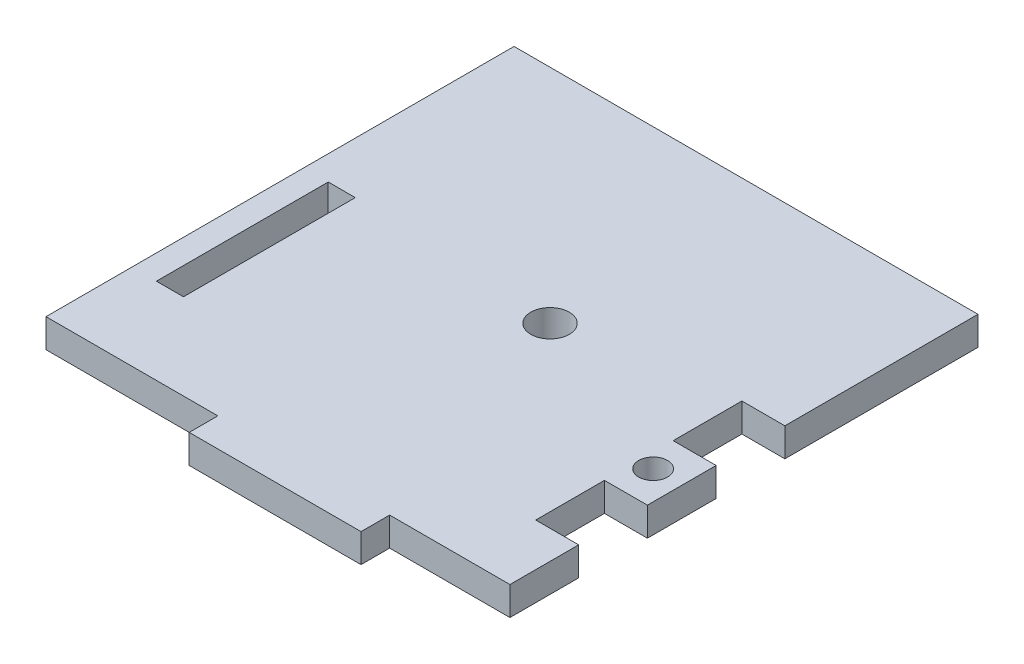
ISO-10303-21;
HEADER;
FILE_DESCRIPTION(('STEP AP214'),'2;1');
FILE_NAME('part.step','',(''),(''),'','','');
FILE_SCHEMA(('AUTOMOTIVE_DESIGN { 1 0 10303 214 1 1 1 1 }'));
ENDSEC;
DATA;
#1=APPLICATION_CONTEXT('core data for automotive mechanical design processes');
#2=APPLICATION_PROTOCOL_DEFINITION('international standard','automotive_design',2000,#1);
#3=PRODUCT_CONTEXT('',#1,'mechanical');
#4=PRODUCT('Part','Part','',(#3));
#5=PRODUCT_RELATED_PRODUCT_CATEGORY('part','',(#4));
#6=PRODUCT_DEFINITION_FORMATION('','',#4);
#7=PRODUCT_DEFINITION_CONTEXT('part definition',#1,'design');
#8=PRODUCT_DEFINITION('design','',#6,#7);
#9=PRODUCT_DEFINITION_SHAPE('','',#8);
#10=(LENGTH_UNIT() NAMED_UNIT(*) SI_UNIT(.MILLI.,.METRE.));
#11=(NAMED_UNIT(*) PLANE_ANGLE_UNIT() SI_UNIT($,.RADIAN.));
#12=(NAMED_UNIT(*) SI_UNIT($,.STERADIAN.) SOLID_ANGLE_UNIT());
#13=UNCERTAINTY_MEASURE_WITH_UNIT(LENGTH_MEASURE(1.E-05),#10,'distance_accuracy_value','');
#14=(GEOMETRIC_REPRESENTATION_CONTEXT(3) GLOBAL_UNCERTAINTY_ASSIGNED_CONTEXT((#13)) GLOBAL_UNIT_ASSIGNED_CONTEXT((#10,
#11,#12)) REPRESENTATION_CONTEXT('',''));
#15=CARTESIAN_POINT('',(0.,0.,0.));
#16=DIRECTION('',(0.,0.,1.));
#17=DIRECTION('',(1.,0.,0.));
#18=AXIS2_PLACEMENT_3D('',#15,#16,#17);
#19=CARTESIAN_POINT('',(0.,3.175,-51.8922));
#20=DIRECTION('',(1.,0.,0.));
#21=DIRECTION('',(0.,0.,-1.));
#22=AXIS2_PLACEMENT_3D('',#19,#20,#21);
#23=PLANE('',#22);
#24=DIRECTION('',(0.,0.,1.));
#25=VECTOR('',#24,1.);
#26=CARTESIAN_POINT('',(0.,0.,-51.8922));
#27=LINE('',#26,#25);
#28=CARTESIAN_POINT('',(0.,0.,-51.8922));
#29=VERTEX_POINT('',#28);
#30=CARTESIAN_POINT('',(0.,0.,0.));
#31=VERTEX_POINT('',#30);
#32=EDGE_CURVE('E217',#29,#31,#27,.T.);
#33=ORIENTED_EDGE('',*,*,#32,.T.);
#34=DIRECTION('',(0.,-1.,0.));
#35=VECTOR('',#34,1.);
#36=CARTESIAN_POINT('',(0.,3.175,0.));
#37=LINE('',#36,#35);
#38=CARTESIAN_POINT('',(0.,3.175,0.));
#39=VERTEX_POINT('',#38);
#40=EDGE_CURVE('E11',#39,#31,#37,.T.);
#41=ORIENTED_EDGE('',*,*,#40,.F.);
#42=DIRECTION('',(0.,0.,1.));
#43=VECTOR('',#42,1.);
#44=CARTESIAN_POINT('',(0.,3.175,-51.8922));
#45=LINE('',#44,#43);
#46=CARTESIAN_POINT('',(0.,3.175,-51.8922));
#47=VERTEX_POINT('',#46);
#48=EDGE_CURVE('E218',#47,#39,#45,.T.);
#49=ORIENTED_EDGE('',*,*,#48,.F.);
#50=DIRECTION('',(0.,-1.,0.));
#51=VECTOR('',#50,1.);
#52=CARTESIAN_POINT('',(0.,3.175,-51.8922));
#53=LINE('',#52,#51);
#54=EDGE_CURVE('E252',#47,#29,#53,.T.);
#55=ORIENTED_EDGE('',*,*,#54,.T.);
#56=EDGE_LOOP('',(#33,#41,#49,#55));
#57=FACE_BOUND('',#56,.T.);
#58=ADVANCED_FACE('F33',(#57),#23,.F.);
#59=CARTESIAN_POINT('',(0.,3.175,0.));
#60=DIRECTION('',(0.,0.,-1.));
#61=DIRECTION('',(-1.,0.,0.));
#62=AXIS2_PLACEMENT_3D('',#59,#60,#61);
#63=PLANE('',#62);
#64=DIRECTION('',(1.,0.,0.));
#65=VECTOR('',#64,1.);
#66=CARTESIAN_POINT('',(0.,0.,0.));
#67=LINE('',#66,#65);
#68=CARTESIAN_POINT('',(19.05,0.,0.));
#69=VERTEX_POINT('',#68);
#70=EDGE_CURVE('E255',#31,#69,#67,.T.);
#71=ORIENTED_EDGE('',*,*,#70,.T.);
#72=DIRECTION('',(0.,-1.,0.));
#73=VECTOR('',#72,1.);
#74=CARTESIAN_POINT('',(19.05,3.175,0.));
#75=LINE('',#74,#73);
#76=CARTESIAN_POINT('',(19.05,3.175,0.));
#77=VERTEX_POINT('',#76);
#78=EDGE_CURVE('E40',#77,#69,#75,.T.);
#79=ORIENTED_EDGE('',*,*,#78,.F.);
#80=DIRECTION('',(1.,0.,0.));
#81=VECTOR('',#80,1.);
#82=CARTESIAN_POINT('',(0.,3.175,0.));
#83=LINE('',#82,#81);
#84=EDGE_CURVE('E221',#39,#77,#83,.T.);
#85=ORIENTED_EDGE('',*,*,#84,.F.);
#86=ORIENTED_EDGE('',*,*,#40,.T.);
#87=EDGE_LOOP('',(#71,#79,#85,#86));
#88=FACE_BOUND('',#87,.T.);
#89=ADVANCED_FACE('F351',(#88),#63,.F.);
#90=CARTESIAN_POINT('',(19.05,3.175,0.));
#91=DIRECTION('',(1.,0.,0.));
#92=DIRECTION('',(0.,0.,-1.));
#93=AXIS2_PLACEMENT_3D('',#90,#91,#92);
#94=PLANE('',#93);
#95=DIRECTION('',(0.,0.,1.));
#96=VECTOR('',#95,1.);
#97=CARTESIAN_POINT('',(19.05,0.,0.));
#98=LINE('',#97,#96);
#99=CARTESIAN_POINT('',(19.05,0.,3.175));
#100=VERTEX_POINT('',#99);
#101=EDGE_CURVE('E257',#69,#100,#98,.T.);
#102=ORIENTED_EDGE('',*,*,#101,.T.);
#103=DIRECTION('',(0.,-1.,0.));
#104=VECTOR('',#103,1.);
#105=CARTESIAN_POINT('',(19.05,3.175,3.175));
#106=LINE('',#105,#104);
#107=CARTESIAN_POINT('',(19.05,3.175,3.175));
#108=VERTEX_POINT('',#107);
#109=EDGE_CURVE('E322',#108,#100,#106,.T.);
#110=ORIENTED_EDGE('',*,*,#109,.F.);
#111=DIRECTION('',(0.,0.,1.));
#112=VECTOR('',#111,1.);
#113=CARTESIAN_POINT('',(19.05,3.175,0.));
#114=LINE('',#113,#112);
#115=EDGE_CURVE('E224',#77,#108,#114,.T.);
#116=ORIENTED_EDGE('',*,*,#115,.F.);
#117=ORIENTED_EDGE('',*,*,#78,.T.);
#118=EDGE_LOOP('',(#102,#110,#116,#117));
#119=FACE_BOUND('',#118,.T.);
#120=ADVANCED_FACE('F329',(#119),#94,.F.);
#121=CARTESIAN_POINT('',(19.05,3.175,3.175));
#122=DIRECTION('',(0.,0.,-1.));
#123=DIRECTION('',(-1.,0.,0.));
#124=AXIS2_PLACEMENT_3D('',#121,#122,#123);
#125=PLANE('',#124);
#126=DIRECTION('',(1.,0.,0.));
#127=VECTOR('',#126,1.);
#128=CARTESIAN_POINT('',(19.05,0.,3.175));
#129=LINE('',#128,#127);
#130=CARTESIAN_POINT('',(38.1,0.,3.175));
#131=VERTEX_POINT('',#130);
#132=EDGE_CURVE('E259',#100,#131,#129,.T.);
#133=ORIENTED_EDGE('',*,*,#132,.T.);
#134=DIRECTION('',(0.,-1.,0.));
#135=VECTOR('',#134,1.);
#136=CARTESIAN_POINT('',(38.1,3.175,3.175));
#137=LINE('',#136,#135);
#138=CARTESIAN_POINT('',(38.1,3.175,3.175));
#139=VERTEX_POINT('',#138);
#140=EDGE_CURVE('E319',#139,#131,#137,.T.);
#141=ORIENTED_EDGE('',*,*,#140,.F.);
#142=DIRECTION('',(1.,0.,0.));
#143=VECTOR('',#142,1.);
#144=CARTESIAN_POINT('',(19.05,3.175,3.175));
#145=LINE('',#144,#143);
#146=EDGE_CURVE('E226',#108,#139,#145,.T.);
#147=ORIENTED_EDGE('',*,*,#146,.F.);
#148=ORIENTED_EDGE('',*,*,#109,.T.);
#149=EDGE_LOOP('',(#133,#141,#147,#148));
#150=FACE_BOUND('',#149,.T.);
#151=ADVANCED_FACE('F339',(#150),#125,.F.);
#152=CARTESIAN_POINT('',(38.1,3.175,3.175));
#153=DIRECTION('',(-1.,0.,0.));
#154=DIRECTION('',(0.,0.,1.));
#155=AXIS2_PLACEMENT_3D('',#152,#153,#154);
#156=PLANE('',#155);
#157=DIRECTION('',(0.,0.,-1.));
#158=VECTOR('',#157,1.);
#159=CARTESIAN_POINT('',(38.1,0.,3.175));
#160=LINE('',#159,#158);
#161=CARTESIAN_POINT('',(38.1,0.,0.));
#162=VERTEX_POINT('',#161);
#163=EDGE_CURVE('E261',#131,#162,#160,.T.);
#164=ORIENTED_EDGE('',*,*,#163,.T.);
#165=DIRECTION('',(0.,-1.,0.));
#166=VECTOR('',#165,1.);
#167=CARTESIAN_POINT('',(38.1,3.175,0.));
#168=LINE('',#167,#166);
#169=CARTESIAN_POINT('',(38.1,3.175,0.));
#170=VERTEX_POINT('',#169);
#171=EDGE_CURVE('E316',#170,#162,#168,.T.);
#172=ORIENTED_EDGE('',*,*,#171,.F.);
#173=DIRECTION('',(0.,0.,-1.));
#174=VECTOR('',#173,1.);
#175=CARTESIAN_POINT('',(38.1,3.175,3.175));
#176=LINE('',#175,#174);
#177=EDGE_CURVE('E228',#139,#170,#176,.T.);
#178=ORIENTED_EDGE('',*,*,#177,.F.);
#179=ORIENTED_EDGE('',*,*,#140,.T.);
#180=EDGE_LOOP('',(#164,#172,#178,#179));
#181=FACE_BOUND('',#180,.T.);
#182=ADVANCED_FACE('F343',(#181),#156,.F.);
#183=CARTESIAN_POINT('',(38.1,3.175,0.));
#184=DIRECTION('',(0.,0.,-1.));
#185=DIRECTION('',(-1.,0.,0.));
#186=AXIS2_PLACEMENT_3D('',#183,#184,#185);
#187=PLANE('',#186);
#188=DIRECTION('',(1.,0.,0.));
#189=VECTOR('',#188,1.);
#190=CARTESIAN_POINT('',(38.1,0.,0.));
#191=LINE('',#190,#189);
#192=CARTESIAN_POINT('',(51.435,0.,0.));
#193=VERTEX_POINT('',#192);
#194=EDGE_CURVE('E263',#162,#193,#191,.T.);
#195=ORIENTED_EDGE('',*,*,#194,.T.);
#196=DIRECTION('',(0.,-1.,0.));
#197=VECTOR('',#196,1.);
#198=CARTESIAN_POINT('',(51.435,3.175,0.));
#199=LINE('',#198,#197);
#200=CARTESIAN_POINT('',(51.435,3.175,0.));
#201=VERTEX_POINT('',#200);
#202=EDGE_CURVE('E313',#201,#193,#199,.T.);
#203=ORIENTED_EDGE('',*,*,#202,.F.);
#204=DIRECTION('',(1.,0.,0.));
#205=VECTOR('',#204,1.);
#206=CARTESIAN_POINT('',(38.1,3.175,0.));
#207=LINE('',#206,#205);
#208=EDGE_CURVE('E230',#170,#201,#207,.T.);
#209=ORIENTED_EDGE('',*,*,#208,.F.);
#210=ORIENTED_EDGE('',*,*,#171,.T.);
#211=EDGE_LOOP('',(#195,#203,#209,#210));
#212=FACE_BOUND('',#211,.T.);
#213=ADVANCED_FACE('F404',(#212),#187,.F.);
#214=CARTESIAN_POINT('',(51.435,3.175,0.));
#215=DIRECTION('',(-1.,0.,0.));
#216=DIRECTION('',(0.,0.,1.));
#217=AXIS2_PLACEMENT_3D('',#214,#215,#216);
#218=PLANE('',#217);
#219=DIRECTION('',(0.,0.,-1.));
#220=VECTOR('',#219,1.);
#221=CARTESIAN_POINT('',(51.435,0.,0.));
#222=LINE('',#221,#220);
#223=CARTESIAN_POINT('',(51.435,0.,-7.62));
#224=VERTEX_POINT('',#223);
#225=EDGE_CURVE('E265',#193,#224,#222,.T.);
#226=ORIENTED_EDGE('',*,*,#225,.T.);
#227=DIRECTION('',(0.,-1.,0.));
#228=VECTOR('',#227,1.);
#229=CARTESIAN_POINT('',(51.435,3.175,-7.62));
#230=LINE('',#229,#228);
#231=CARTESIAN_POINT('',(51.435,3.175,-7.62));
#232=VERTEX_POINT('',#231);
#233=EDGE_CURVE('E310',#232,#224,#230,.T.);
#234=ORIENTED_EDGE('',*,*,#233,.F.);
#235=DIRECTION('',(0.,0.,-1.));
#236=VECTOR('',#235,1.);
#237=CARTESIAN_POINT('',(51.435,3.175,0.));
#238=LINE('',#237,#236);
#239=EDGE_CURVE('E232',#201,#232,#238,.T.);
#240=ORIENTED_EDGE('',*,*,#239,.F.);
#241=ORIENTED_EDGE('',*,*,#202,.T.);
#242=EDGE_LOOP('',(#226,#234,#240,#241));
#243=FACE_BOUND('',#242,.T.);
#244=ADVANCED_FACE('F401',(#243),#218,.F.);
#245=CARTESIAN_POINT('',(46.6725,3.175,-7.62));
#246=DIRECTION('',(0.,0.,1.));
#247=DIRECTION('',(1.,0.,0.));
#248=AXIS2_PLACEMENT_3D('',#245,#246,#247);
#249=PLANE('',#248);
#250=DIRECTION('',(-1.,0.,0.));
#251=VECTOR('',#250,1.);
#252=CARTESIAN_POINT('',(46.6725,0.,-7.62));
#253=LINE('',#252,#251);
#254=CARTESIAN_POINT('',(46.6725,0.,-7.62));
#255=VERTEX_POINT('',#254);
#256=EDGE_CURVE('E267',#224,#255,#253,.T.);
#257=ORIENTED_EDGE('',*,*,#256,.T.);
#258=DIRECTION('',(0.,-1.,0.));
#259=VECTOR('',#258,1.);
#260=CARTESIAN_POINT('',(46.6725,3.175,-7.62));
#261=LINE('',#260,#259);
#262=CARTESIAN_POINT('',(46.6725,3.175,-7.62));
#263=VERTEX_POINT('',#262);
#264=EDGE_CURVE('E307',#263,#255,#261,.T.);
#265=ORIENTED_EDGE('',*,*,#264,.F.);
#266=DIRECTION('',(-1.,0.,0.));
#267=VECTOR('',#266,1.);
#268=CARTESIAN_POINT('',(46.6725,3.175,-7.62));
#269=LINE('',#268,#267);
#270=EDGE_CURVE('E234',#232,#263,#269,.T.);
#271=ORIENTED_EDGE('',*,*,#270,.F.);
#272=ORIENTED_EDGE('',*,*,#233,.T.);
#273=EDGE_LOOP('',(#257,#265,#271,#272));
#274=FACE_BOUND('',#273,.T.);
#275=ADVANCED_FACE('F397',(#274),#249,.F.);
#276=CARTESIAN_POINT('',(46.6725,3.175,-15.24));
#277=DIRECTION('',(-1.,0.,0.));
#278=DIRECTION('',(0.,0.,1.));
#279=AXIS2_PLACEMENT_3D('',#276,#277,#278);
#280=PLANE('',#279);
#281=DIRECTION('',(0.,0.,-1.));
#282=VECTOR('',#281,1.);
#283=CARTESIAN_POINT('',(46.6725,0.,-15.24));
#284=LINE('',#283,#282);
#285=CARTESIAN_POINT('',(46.6725,0.,-15.24));
#286=VERTEX_POINT('',#285);
#287=EDGE_CURVE('E269',#255,#286,#284,.T.);
#288=ORIENTED_EDGE('',*,*,#287,.T.);
#289=DIRECTION('',(0.,-1.,0.));
#290=VECTOR('',#289,1.);
#291=CARTESIAN_POINT('',(46.6725,3.175,-15.24));
#292=LINE('',#291,#290);
#293=CARTESIAN_POINT('',(46.6725,3.175,-15.24));
#294=VERTEX_POINT('',#293);
#295=EDGE_CURVE('E304',#294,#286,#292,.T.);
#296=ORIENTED_EDGE('',*,*,#295,.F.);
#297=DIRECTION('',(0.,0.,-1.));
#298=VECTOR('',#297,1.);
#299=CARTESIAN_POINT('',(46.6725,3.175,-15.24));
#300=LINE('',#299,#298);
#301=EDGE_CURVE('E236',#263,#294,#300,.T.);
#302=ORIENTED_EDGE('',*,*,#301,.F.);
#303=ORIENTED_EDGE('',*,*,#264,.T.);
#304=EDGE_LOOP('',(#288,#296,#302,#303));
#305=FACE_BOUND('',#304,.T.);
#306=ADVANCED_FACE('F393',(#305),#280,.F.);
#307=CARTESIAN_POINT('',(46.6725,3.175,-15.24));
#308=DIRECTION('',(0.,0.,-1.));
#309=DIRECTION('',(-1.,0.,0.));
#310=AXIS2_PLACEMENT_3D('',#307,#308,#309);
#311=PLANE('',#310);
#312=DIRECTION('',(1.,0.,0.));
#313=VECTOR('',#312,1.);
#314=CARTESIAN_POINT('',(46.6725,0.,-15.24));
#315=LINE('',#314,#313);
#316=CARTESIAN_POINT('',(51.435,0.,-15.24));
#317=VERTEX_POINT('',#316);
#318=EDGE_CURVE('E271',#286,#317,#315,.T.);
#319=ORIENTED_EDGE('',*,*,#318,.T.);
#320=DIRECTION('',(0.,-1.,0.));
#321=VECTOR('',#320,1.);
#322=CARTESIAN_POINT('',(51.435,3.175,-15.24));
#323=LINE('',#322,#321);
#324=CARTESIAN_POINT('',(51.435,3.175,-15.24));
#325=VERTEX_POINT('',#324);
#326=EDGE_CURVE('E301',#325,#317,#323,.T.);
#327=ORIENTED_EDGE('',*,*,#326,.F.);
#328=DIRECTION('',(1.,0.,0.));
#329=VECTOR('',#328,1.);
#330=CARTESIAN_POINT('',(46.6725,3.175,-15.24));
#331=LINE('',#330,#329);
#332=EDGE_CURVE('E238',#294,#325,#331,.T.);
#333=ORIENTED_EDGE('',*,*,#332,.F.);
#334=ORIENTED_EDGE('',*,*,#295,.T.);
#335=EDGE_LOOP('',(#319,#327,#333,#334));
#336=FACE_BOUND('',#335,.T.);
#337=ADVANCED_FACE('F388',(#336),#311,.F.);
#338=CARTESIAN_POINT('',(51.435,3.175,-15.24));
#339=DIRECTION('',(-1.,0.,0.));
#340=DIRECTION('',(0.,0.,1.));
#341=AXIS2_PLACEMENT_3D('',#338,#339,#340);
#342=PLANE('',#341);
#343=DIRECTION('',(0.,0.,-1.));
#344=VECTOR('',#343,1.);
#345=CARTESIAN_POINT('',(51.435,0.,-15.24));
#346=LINE('',#345,#344);
#347=CARTESIAN_POINT('',(51.435,0.,-22.86));
#348=VERTEX_POINT('',#347);
#349=EDGE_CURVE('E273',#317,#348,#346,.T.);
#350=ORIENTED_EDGE('',*,*,#349,.T.);
#351=DIRECTION('',(0.,-1.,0.));
#352=VECTOR('',#351,1.);
#353=CARTESIAN_POINT('',(51.435,3.175,-22.86));
#354=LINE('',#353,#352);
#355=CARTESIAN_POINT('',(51.435,3.175,-22.86));
#356=VERTEX_POINT('',#355);
#357=EDGE_CURVE('E298',#356,#348,#354,.T.);
#358=ORIENTED_EDGE('',*,*,#357,.F.);
#359=DIRECTION('',(0.,0.,-1.));
#360=VECTOR('',#359,1.);
#361=CARTESIAN_POINT('',(51.435,3.175,-15.24));
#362=LINE('',#361,#360);
#363=EDGE_CURVE('E240',#325,#356,#362,.T.);
#364=ORIENTED_EDGE('',*,*,#363,.F.);
#365=ORIENTED_EDGE('',*,*,#326,.T.);
#366=EDGE_LOOP('',(#350,#358,#364,#365));
#367=FACE_BOUND('',#366,.T.);
#368=ADVANCED_FACE('F382',(#367),#342,.F.);
#369=CARTESIAN_POINT('',(46.6725,3.175,-22.86));
#370=DIRECTION('',(0.,0.,1.));
#371=DIRECTION('',(1.,0.,0.));
#372=AXIS2_PLACEMENT_3D('',#369,#370,#371);
#373=PLANE('',#372);
#374=DIRECTION('',(-1.,0.,0.));
#375=VECTOR('',#374,1.);
#376=CARTESIAN_POINT('',(46.6725,0.,-22.86));
#377=LINE('',#376,#375);
#378=CARTESIAN_POINT('',(46.6725,0.,-22.86));
#379=VERTEX_POINT('',#378);
#380=EDGE_CURVE('E275',#348,#379,#377,.T.);
#381=ORIENTED_EDGE('',*,*,#380,.T.);
#382=DIRECTION('',(0.,-1.,0.));
#383=VECTOR('',#382,1.);
#384=CARTESIAN_POINT('',(46.6725,3.175,-22.86));
#385=LINE('',#384,#383);
#386=CARTESIAN_POINT('',(46.6725,3.175,-22.86));
#387=VERTEX_POINT('',#386);
#388=EDGE_CURVE('E295',#387,#379,#385,.T.);
#389=ORIENTED_EDGE('',*,*,#388,.F.);
#390=DIRECTION('',(-1.,0.,0.));
#391=VECTOR('',#390,1.);
#392=CARTESIAN_POINT('',(46.6725,3.175,-22.86));
#393=LINE('',#392,#391);
#394=EDGE_CURVE('E242',#356,#387,#393,.T.);
#395=ORIENTED_EDGE('',*,*,#394,.F.);
#396=ORIENTED_EDGE('',*,*,#357,.T.);
#397=EDGE_LOOP('',(#381,#389,#395,#396));
#398=FACE_BOUND('',#397,.T.);
#399=ADVANCED_FACE('F378',(#398),#373,.F.);
#400=CARTESIAN_POINT('',(46.6725,3.175,-30.48));
#401=DIRECTION('',(-1.,0.,0.));
#402=DIRECTION('',(0.,0.,1.));
#403=AXIS2_PLACEMENT_3D('',#400,#401,#402);
#404=PLANE('',#403);
#405=DIRECTION('',(0.,0.,-1.));
#406=VECTOR('',#405,1.);
#407=CARTESIAN_POINT('',(46.6725,0.,-30.48));
#408=LINE('',#407,#406);
#409=CARTESIAN_POINT('',(46.6725,0.,-30.48));
#410=VERTEX_POINT('',#409);
#411=EDGE_CURVE('E277',#379,#410,#408,.T.);
#412=ORIENTED_EDGE('',*,*,#411,.T.);
#413=DIRECTION('',(0.,-1.,0.));
#414=VECTOR('',#413,1.);
#415=CARTESIAN_POINT('',(46.6725,3.175,-30.48));
#416=LINE('',#415,#414);
#417=CARTESIAN_POINT('',(46.6725,3.175,-30.48));
#418=VERTEX_POINT('',#417);
#419=EDGE_CURVE('E292',#418,#410,#416,.T.);
#420=ORIENTED_EDGE('',*,*,#419,.F.);
#421=DIRECTION('',(0.,0.,-1.));
#422=VECTOR('',#421,1.);
#423=CARTESIAN_POINT('',(46.6725,3.175,-30.48));
#424=LINE('',#423,#422);
#425=EDGE_CURVE('E244',#387,#418,#424,.T.);
#426=ORIENTED_EDGE('',*,*,#425,.F.);
#427=ORIENTED_EDGE('',*,*,#388,.T.);
#428=EDGE_LOOP('',(#412,#420,#426,#427));
#429=FACE_BOUND('',#428,.T.);
#430=ADVANCED_FACE('F373',(#429),#404,.F.);
#431=CARTESIAN_POINT('',(46.6725,3.175,-30.48));
#432=DIRECTION('',(0.,0.,-1.));
#433=DIRECTION('',(-1.,0.,0.));
#434=AXIS2_PLACEMENT_3D('',#431,#432,#433);
#435=PLANE('',#434);
#436=DIRECTION('',(1.,0.,0.));
#437=VECTOR('',#436,1.);
#438=CARTESIAN_POINT('',(46.6725,0.,-30.48));
#439=LINE('',#438,#437);
#440=CARTESIAN_POINT('',(51.435,0.,-30.48));
#441=VERTEX_POINT('',#440);
#442=EDGE_CURVE('E279',#410,#441,#439,.T.);
#443=ORIENTED_EDGE('',*,*,#442,.T.);
#444=DIRECTION('',(0.,-1.,0.));
#445=VECTOR('',#444,1.);
#446=CARTESIAN_POINT('',(51.435,3.175,-30.48));
#447=LINE('',#446,#445);
#448=CARTESIAN_POINT('',(51.435,3.175,-30.48));
#449=VERTEX_POINT('',#448);
#450=EDGE_CURVE('E289',#449,#441,#447,.T.);
#451=ORIENTED_EDGE('',*,*,#450,.F.);
#452=DIRECTION('',(1.,0.,0.));
#453=VECTOR('',#452,1.);
#454=CARTESIAN_POINT('',(46.6725,3.175,-30.48));
#455=LINE('',#454,#453);
#456=EDGE_CURVE('E246',#418,#449,#455,.T.);
#457=ORIENTED_EDGE('',*,*,#456,.F.);
#458=ORIENTED_EDGE('',*,*,#419,.T.);
#459=EDGE_LOOP('',(#443,#451,#457,#458));
#460=FACE_BOUND('',#459,.T.);
#461=ADVANCED_FACE('F367',(#460),#435,.F.);
#462=CARTESIAN_POINT('',(51.435,3.175,-30.48));
#463=DIRECTION('',(-1.,0.,0.));
#464=DIRECTION('',(0.,0.,1.));
#465=AXIS2_PLACEMENT_3D('',#462,#463,#464);
#466=PLANE('',#465);
#467=DIRECTION('',(0.,0.,-1.));
#468=VECTOR('',#467,1.);
#469=CARTESIAN_POINT('',(51.435,0.,-30.48));
#470=LINE('',#469,#468);
#471=CARTESIAN_POINT('',(51.435,0.,-51.8922));
#472=VERTEX_POINT('',#471);
#473=EDGE_CURVE('E281',#441,#472,#470,.T.);
#474=ORIENTED_EDGE('',*,*,#473,.T.);
#475=DIRECTION('',(0.,-1.,0.));
#476=VECTOR('',#475,1.);
#477=CARTESIAN_POINT('',(51.435,3.175,-51.8922));
#478=LINE('',#477,#476);
#479=CARTESIAN_POINT('',(51.435,3.175,-51.8922));
#480=VERTEX_POINT('',#479);
#481=EDGE_CURVE('E286',#480,#472,#478,.T.);
#482=ORIENTED_EDGE('',*,*,#481,.F.);
#483=DIRECTION('',(0.,0.,-1.));
#484=VECTOR('',#483,1.);
#485=CARTESIAN_POINT('',(51.435,3.175,-30.48));
#486=LINE('',#485,#484);
#487=EDGE_CURVE('E248',#449,#480,#486,.T.);
#488=ORIENTED_EDGE('',*,*,#487,.F.);
#489=ORIENTED_EDGE('',*,*,#450,.T.);
#490=EDGE_LOOP('',(#474,#482,#488,#489));
#491=FACE_BOUND('',#490,.T.);
#492=ADVANCED_FACE('F363',(#491),#466,.F.);
#493=CARTESIAN_POINT('',(51.435,3.175,-51.8922));
#494=DIRECTION('',(0.,0.,1.));
#495=DIRECTION('',(1.,0.,0.));
#496=AXIS2_PLACEMENT_3D('',#493,#494,#495);
#497=PLANE('',#496);
#498=DIRECTION('',(-1.,0.,0.));
#499=VECTOR('',#498,1.);
#500=CARTESIAN_POINT('',(51.435,0.,-51.8922));
#501=LINE('',#500,#499);
#502=EDGE_CURVE('E222',#472,#29,#501,.T.);
#503=ORIENTED_EDGE('',*,*,#502,.T.);
#504=ORIENTED_EDGE('',*,*,#54,.F.);
#505=DIRECTION('',(-1.,0.,0.));
#506=VECTOR('',#505,1.);
#507=CARTESIAN_POINT('',(51.435,3.175,-51.8922));
#508=LINE('',#507,#506);
#509=EDGE_CURVE('E250',#480,#47,#508,.T.);
#510=ORIENTED_EDGE('',*,*,#509,.F.);
#511=ORIENTED_EDGE('',*,*,#481,.T.);
#512=EDGE_LOOP('',(#503,#504,#510,#511));
#513=FACE_BOUND('',#512,.T.);
#514=ADVANCED_FACE('F358',(#513),#497,.F.);
#515=CARTESIAN_POINT('',(0.,3.175,0.));
#516=DIRECTION('',(0.,1.,0.));
#517=DIRECTION('',(0.,0.,1.));
#518=AXIS2_PLACEMENT_3D('',#515,#516,#517);
#519=PLANE('',#518);
#520=DIRECTION('',(0.,0.,1.));
#521=VECTOR('',#520,1.);
#522=CARTESIAN_POINT('',(2.715,3.175,-28.575));
#523=LINE('',#522,#521);
#524=CARTESIAN_POINT('',(2.715,3.175,-28.575));
#525=VERTEX_POINT('',#524);
#526=CARTESIAN_POINT('',(2.715,3.175,-9.525));
#527=VERTEX_POINT('',#526);
#528=EDGE_CURVE('E47',#525,#527,#523,.T.);
#529=ORIENTED_EDGE('',*,*,#528,.F.);
#530=DIRECTION('',(-1.,0.,0.));
#531=VECTOR('',#530,1.);
#532=CARTESIAN_POINT('',(2.715,3.175,-28.575));
#533=LINE('',#532,#531);
#534=CARTESIAN_POINT('',(5.715,3.175,-28.575));
#535=VERTEX_POINT('',#534);
#536=EDGE_CURVE('E187',#535,#525,#533,.T.);
#537=ORIENTED_EDGE('',*,*,#536,.F.);
#538=DIRECTION('',(0.,0.,-1.));
#539=VECTOR('',#538,1.);
#540=CARTESIAN_POINT('',(5.715,3.175,-28.575));
#541=LINE('',#540,#539);
#542=CARTESIAN_POINT('',(5.715,3.175,-9.525));
#543=VERTEX_POINT('',#542);
#544=EDGE_CURVE('E190',#543,#535,#541,.T.);
#545=ORIENTED_EDGE('',*,*,#544,.F.);
#546=DIRECTION('',(1.,0.,0.));
#547=VECTOR('',#546,1.);
#548=CARTESIAN_POINT('',(2.715,3.175,-9.525));
#549=LINE('',#548,#547);
#550=EDGE_CURVE('E196',#527,#543,#549,.T.);
#551=ORIENTED_EDGE('',*,*,#550,.F.);
#552=EDGE_LOOP('',(#529,#537,#545,#551));
#553=FACE_BOUND('',#552,.T.);
#554=CARTESIAN_POINT('',(28.575,3.175,-27.305));
#555=DIRECTION('',(0.,1.,0.));
#556=DIRECTION('',(0.,0.,1.));
#557=AXIS2_PLACEMENT_3D('',#554,#555,#556);
#558=CIRCLE('',#557,2.13359999999999);
#559=CARTESIAN_POINT('',(28.575,3.175,-25.1714));
#560=VERTEX_POINT('',#559);
#561=EDGE_CURVE('E202',#560,#560,#558,.T.);
#562=ORIENTED_EDGE('',*,*,#561,.F.);
#563=EDGE_LOOP('',(#562));
#564=FACE_BOUND('',#563,.T.);
#565=CARTESIAN_POINT('',(48.26,3.175,-19.05));
#566=DIRECTION('',(0.,1.,0.));
#567=DIRECTION('',(0.,0.,1.));
#568=AXIS2_PLACEMENT_3D('',#565,#566,#567);
#569=CIRCLE('',#568,1.6);
#570=CARTESIAN_POINT('',(48.26,3.175,-17.45));
#571=VERTEX_POINT('',#570);
#572=EDGE_CURVE('E209',#571,#571,#569,.T.);
#573=ORIENTED_EDGE('',*,*,#572,.F.);
#574=EDGE_LOOP('',(#573));
#575=FACE_BOUND('',#574,.T.);
#576=ORIENTED_EDGE('',*,*,#48,.T.);
#577=ORIENTED_EDGE('',*,*,#84,.T.);
#578=ORIENTED_EDGE('',*,*,#115,.T.);
#579=ORIENTED_EDGE('',*,*,#146,.T.);
#580=ORIENTED_EDGE('',*,*,#177,.T.);
#581=ORIENTED_EDGE('',*,*,#208,.T.);
#582=ORIENTED_EDGE('',*,*,#239,.T.);
#583=ORIENTED_EDGE('',*,*,#270,.T.);
#584=ORIENTED_EDGE('',*,*,#301,.T.);
#585=ORIENTED_EDGE('',*,*,#332,.T.);
#586=ORIENTED_EDGE('',*,*,#363,.T.);
#587=ORIENTED_EDGE('',*,*,#394,.T.);
#588=ORIENTED_EDGE('',*,*,#425,.T.);
#589=ORIENTED_EDGE('',*,*,#456,.T.);
#590=ORIENTED_EDGE('',*,*,#487,.T.);
#591=ORIENTED_EDGE('',*,*,#509,.T.);
#592=EDGE_LOOP('',(#576,#577,#578,#579,#580,#581,#582,#583,#584,#585,#586,#587,#588,#589,#590,#591));
#593=FACE_BOUND('',#592,.T.);
#594=ADVANCED_FACE('F347',(#553,#564,#575,#593),#519,.T.);
#595=CARTESIAN_POINT('',(0.,0.,0.));
#596=DIRECTION('',(0.,1.,0.));
#597=DIRECTION('',(0.,0.,1.));
#598=AXIS2_PLACEMENT_3D('',#595,#596,#597);
#599=PLANE('',#598);
#600=DIRECTION('',(-1.,0.,0.));
#601=VECTOR('',#600,1.);
#602=CARTESIAN_POINT('',(2.715,0.,-28.575));
#603=LINE('',#602,#601);
#604=CARTESIAN_POINT('',(5.715,0.,-28.575));
#605=VERTEX_POINT('',#604);
#606=CARTESIAN_POINT('',(2.715,0.,-28.575));
#607=VERTEX_POINT('',#606);
#608=EDGE_CURVE('E177',#605,#607,#603,.T.);
#609=ORIENTED_EDGE('',*,*,#608,.T.);
#610=DIRECTION('',(0.,0.,1.));
#611=VECTOR('',#610,1.);
#612=CARTESIAN_POINT('',(2.715,0.,-28.575));
#613=LINE('',#612,#611);
#614=CARTESIAN_POINT('',(2.715,0.,-9.525));
#615=VERTEX_POINT('',#614);
#616=EDGE_CURVE('E171',#607,#615,#613,.T.);
#617=ORIENTED_EDGE('',*,*,#616,.T.);
#618=DIRECTION('',(1.,0.,0.));
#619=VECTOR('',#618,1.);
#620=CARTESIAN_POINT('',(2.715,0.,-9.525));
#621=LINE('',#620,#619);
#622=CARTESIAN_POINT('',(5.715,0.,-9.525));
#623=VERTEX_POINT('',#622);
#624=EDGE_CURVE('E180',#615,#623,#621,.T.);
#625=ORIENTED_EDGE('',*,*,#624,.T.);
#626=DIRECTION('',(0.,0.,-1.));
#627=VECTOR('',#626,1.);
#628=CARTESIAN_POINT('',(5.715,0.,-28.575));
#629=LINE('',#628,#627);
#630=EDGE_CURVE('E55',#623,#605,#629,.T.);
#631=ORIENTED_EDGE('',*,*,#630,.T.);
#632=EDGE_LOOP('',(#609,#617,#625,#631));
#633=FACE_BOUND('',#632,.T.);
#634=CARTESIAN_POINT('',(28.575,0.,-27.305));
#635=DIRECTION('',(0.,1.,0.));
#636=DIRECTION('',(0.,0.,1.));
#637=AXIS2_PLACEMENT_3D('',#634,#635,#636);
#638=CIRCLE('',#637,2.13359999999999);
#639=CARTESIAN_POINT('',(28.575,0.,-25.1714));
#640=VERTEX_POINT('',#639);
#641=EDGE_CURVE('E206',#640,#640,#638,.T.);
#642=ORIENTED_EDGE('',*,*,#641,.T.);
#643=EDGE_LOOP('',(#642));
#644=FACE_BOUND('',#643,.T.);
#645=CARTESIAN_POINT('',(48.26,0.,-19.05));
#646=DIRECTION('',(0.,1.,0.));
#647=DIRECTION('',(0.,0.,1.));
#648=AXIS2_PLACEMENT_3D('',#645,#646,#647);
#649=CIRCLE('',#648,1.6);
#650=CARTESIAN_POINT('',(48.26,0.,-17.45));
#651=VERTEX_POINT('',#650);
#652=EDGE_CURVE('E214',#651,#651,#649,.T.);
#653=ORIENTED_EDGE('',*,*,#652,.T.);
#654=EDGE_LOOP('',(#653));
#655=FACE_BOUND('',#654,.T.);
#656=ORIENTED_EDGE('',*,*,#32,.F.);
#657=ORIENTED_EDGE('',*,*,#502,.F.);
#658=ORIENTED_EDGE('',*,*,#473,.F.);
#659=ORIENTED_EDGE('',*,*,#442,.F.);
#660=ORIENTED_EDGE('',*,*,#411,.F.);
#661=ORIENTED_EDGE('',*,*,#380,.F.);
#662=ORIENTED_EDGE('',*,*,#349,.F.);
#663=ORIENTED_EDGE('',*,*,#318,.F.);
#664=ORIENTED_EDGE('',*,*,#287,.F.);
#665=ORIENTED_EDGE('',*,*,#256,.F.);
#666=ORIENTED_EDGE('',*,*,#225,.F.);
#667=ORIENTED_EDGE('',*,*,#194,.F.);
#668=ORIENTED_EDGE('',*,*,#163,.F.);
#669=ORIENTED_EDGE('',*,*,#132,.F.);
#670=ORIENTED_EDGE('',*,*,#101,.F.);
#671=ORIENTED_EDGE('',*,*,#70,.F.);
#672=EDGE_LOOP('',(#656,#657,#658,#659,#660,#661,#662,#663,#664,#665,#666,#667,#668,#669,#670,#671));
#673=FACE_BOUND('',#672,.T.);
#674=ADVANCED_FACE('F184',(#633,#644,#655,#673),#599,.F.);
#675=CARTESIAN_POINT('',(48.26,3.175,-19.05));
#676=DIRECTION('',(0.,1.,0.));
#677=DIRECTION('',(0.,0.,1.));
#678=AXIS2_PLACEMENT_3D('',#675,#676,#677);
#679=CYLINDRICAL_SURFACE('',#678,1.6);
#680=ORIENTED_EDGE('',*,*,#652,.F.);
#681=EDGE_LOOP('',(#680));
#682=FACE_BOUND('',#681,.T.);
#683=ORIENTED_EDGE('',*,*,#572,.T.);
#684=EDGE_LOOP('',(#683));
#685=FACE_BOUND('',#684,.T.);
#686=ADVANCED_FACE('F520',(#682,#685),#679,.F.);
#687=CARTESIAN_POINT('',(28.575,0.,-27.305));
#688=DIRECTION('',(0.,1.,0.));
#689=DIRECTION('',(0.,0.,1.));
#690=AXIS2_PLACEMENT_3D('',#687,#688,#689);
#691=CYLINDRICAL_SURFACE('',#690,2.13359999999999);
#692=ORIENTED_EDGE('',*,*,#641,.F.);
#693=EDGE_LOOP('',(#692));
#694=FACE_BOUND('',#693,.T.);
#695=ORIENTED_EDGE('',*,*,#561,.T.);
#696=EDGE_LOOP('',(#695));
#697=FACE_BOUND('',#696,.T.);
#698=ADVANCED_FACE('F525',(#694,#697),#691,.F.);
#699=CARTESIAN_POINT('',(2.715,0.,-28.575));
#700=DIRECTION('',(-1.,0.,0.));
#701=DIRECTION('',(0.,0.,1.));
#702=AXIS2_PLACEMENT_3D('',#699,#700,#701);
#703=PLANE('',#702);
#704=ORIENTED_EDGE('',*,*,#528,.T.);
#705=DIRECTION('',(0.,1.,0.));
#706=VECTOR('',#705,1.);
#707=CARTESIAN_POINT('',(2.715,0.,-9.525));
#708=LINE('',#707,#706);
#709=EDGE_CURVE('E167',#615,#527,#708,.T.);
#710=ORIENTED_EDGE('',*,*,#709,.F.);
#711=ORIENTED_EDGE('',*,*,#616,.F.);
#712=DIRECTION('',(0.,1.,0.));
#713=VECTOR('',#712,1.);
#714=CARTESIAN_POINT('',(2.715,0.,-28.575));
#715=LINE('',#714,#713);
#716=EDGE_CURVE('E200',#607,#525,#715,.T.);
#717=ORIENTED_EDGE('',*,*,#716,.T.);
#718=EDGE_LOOP('',(#704,#710,#711,#717));
#719=FACE_BOUND('',#718,.T.);
#720=ADVANCED_FACE('F169',(#719),#703,.F.);
#721=CARTESIAN_POINT('',(2.715,0.,-28.575));
#722=DIRECTION('',(0.,0.,-1.));
#723=DIRECTION('',(-1.,0.,0.));
#724=AXIS2_PLACEMENT_3D('',#721,#722,#723);
#725=PLANE('',#724);
#726=ORIENTED_EDGE('',*,*,#536,.T.);
#727=ORIENTED_EDGE('',*,*,#716,.F.);
#728=ORIENTED_EDGE('',*,*,#608,.F.);
#729=DIRECTION('',(0.,1.,0.));
#730=VECTOR('',#729,1.);
#731=CARTESIAN_POINT('',(5.715,0.,-28.575));
#732=LINE('',#731,#730);
#733=EDGE_CURVE('E203',#605,#535,#732,.T.);
#734=ORIENTED_EDGE('',*,*,#733,.T.);
#735=EDGE_LOOP('',(#726,#727,#728,#734));
#736=FACE_BOUND('',#735,.T.);
#737=ADVANCED_FACE('F563',(#736),#725,.F.);
#738=CARTESIAN_POINT('',(5.715,0.,-28.575));
#739=DIRECTION('',(1.,0.,0.));
#740=DIRECTION('',(0.,0.,-1.));
#741=AXIS2_PLACEMENT_3D('',#738,#739,#740);
#742=PLANE('',#741);
#743=ORIENTED_EDGE('',*,*,#544,.T.);
#744=ORIENTED_EDGE('',*,*,#733,.F.);
#745=ORIENTED_EDGE('',*,*,#630,.F.);
#746=DIRECTION('',(0.,1.,0.));
#747=VECTOR('',#746,1.);
#748=CARTESIAN_POINT('',(5.715,0.,-9.525));
#749=LINE('',#748,#747);
#750=EDGE_CURVE('E176',#623,#543,#749,.T.);
#751=ORIENTED_EDGE('',*,*,#750,.T.);
#752=EDGE_LOOP('',(#743,#744,#745,#751));
#753=FACE_BOUND('',#752,.T.);
#754=ADVANCED_FACE('F572',(#753),#742,.F.);
#755=CARTESIAN_POINT('',(2.715,0.,-9.525));
#756=DIRECTION('',(0.,0.,1.));
#757=DIRECTION('',(1.,0.,0.));
#758=AXIS2_PLACEMENT_3D('',#755,#756,#757);
#759=PLANE('',#758);
#760=ORIENTED_EDGE('',*,*,#550,.T.);
#761=ORIENTED_EDGE('',*,*,#750,.F.);
#762=ORIENTED_EDGE('',*,*,#624,.F.);
#763=ORIENTED_EDGE('',*,*,#709,.T.);
#764=EDGE_LOOP('',(#760,#761,#762,#763));
#765=FACE_BOUND('',#764,.T.);
#766=ADVANCED_FACE('F181',(#765),#759,.F.);
#767=CLOSED_SHELL('',(#58,#89,#120,#151,#182,#213,#244,#275,#306,#337,#368,#399,#430,#461,#492,
#514,#594,#674,#686,#698,#720,#737,#754,#766));
#768=MANIFOLD_SOLID_BREP('B2',#767);
#769=ADVANCED_BREP_SHAPE_REPRESENTATION('',(#18,#768),#14);
#770=SHAPE_DEFINITION_REPRESENTATION(#9,#769);
ENDSEC;
END-ISO-10303-21;
